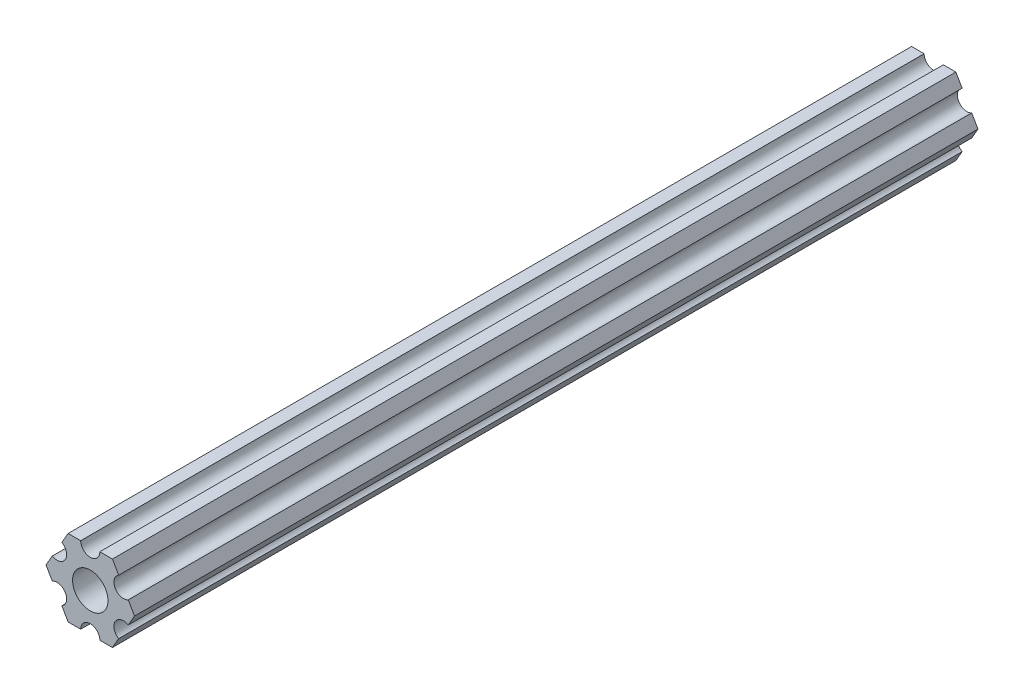
ISO-10303-21;
HEADER;
FILE_DESCRIPTION(('STEP AP214'),'2;1');
FILE_NAME('part.step','',(''),(''),'','','');
FILE_SCHEMA(('AUTOMOTIVE_DESIGN { 1 0 10303 214 1 1 1 1 }'));
ENDSEC;
DATA;
#1=APPLICATION_CONTEXT('core data for automotive mechanical design processes');
#2=APPLICATION_PROTOCOL_DEFINITION('international standard','automotive_design',2000,#1);
#3=PRODUCT_CONTEXT('',#1,'mechanical');
#4=PRODUCT('Part','Part','',(#3));
#5=PRODUCT_RELATED_PRODUCT_CATEGORY('part','',(#4));
#6=PRODUCT_DEFINITION_FORMATION('','',#4);
#7=PRODUCT_DEFINITION_CONTEXT('part definition',#1,'design');
#8=PRODUCT_DEFINITION('design','',#6,#7);
#9=PRODUCT_DEFINITION_SHAPE('','',#8);
#10=(LENGTH_UNIT() NAMED_UNIT(*) SI_UNIT(.MILLI.,.METRE.));
#11=(NAMED_UNIT(*) PLANE_ANGLE_UNIT() SI_UNIT($,.RADIAN.));
#12=(NAMED_UNIT(*) SI_UNIT($,.STERADIAN.) SOLID_ANGLE_UNIT());
#13=UNCERTAINTY_MEASURE_WITH_UNIT(LENGTH_MEASURE(1.E-05),#10,'distance_accuracy_value','');
#14=(GEOMETRIC_REPRESENTATION_CONTEXT(3) GLOBAL_UNCERTAINTY_ASSIGNED_CONTEXT((#13)) GLOBAL_UNIT_ASSIGNED_CONTEXT((#10,
#11,#12)) REPRESENTATION_CONTEXT('',''));
#15=CARTESIAN_POINT('',(0.,0.,0.));
#16=DIRECTION('',(0.,0.,1.));
#17=DIRECTION('',(1.,0.,0.));
#18=AXIS2_PLACEMENT_3D('',#15,#16,#17);
#19=CARTESIAN_POINT('',(6.29301142309098,-1.80018429024546,85.725));
#20=DIRECTION('',(-0.866025434075723,0.499999947533953,0.));
#21=DIRECTION('',(0.,0.,1.));
#22=AXIS2_PLACEMENT_3D('',#19,#20,#21);
#23=PLANE('',#22);
#24=DIRECTION('',(0.,0.,1.));
#25=VECTOR('',#24,1.);
#26=CARTESIAN_POINT('',(7.33234841870827,4.44212519169686E-07,85.725));
#27=LINE('',#26,#25);
#28=CARTESIAN_POINT('',(7.33234841870826,4.44212518961143E-07,-53.975));
#29=VERTEX_POINT('',#28);
#30=CARTESIAN_POINT('',(7.33234841870826,4.44212519315656E-07,85.725));
#31=VERTEX_POINT('',#30);
#32=EDGE_CURVE('E11',#29,#31,#27,.T.);
#33=ORIENTED_EDGE('',*,*,#32,.T.);
#34=DIRECTION('',(0.499999947533953,0.866025434075723,0.));
#35=VECTOR('',#34,1.);
#36=CARTESIAN_POINT('',(6.29301142309098,-1.80018429024546,85.725));
#37=LINE('',#36,#35);
#38=CARTESIAN_POINT('',(6.29301142309098,-1.80018429024546,85.725));
#39=VERTEX_POINT('',#38);
#40=EDGE_CURVE('E301',#39,#31,#37,.T.);
#41=ORIENTED_EDGE('',*,*,#40,.F.);
#42=DIRECTION('',(0.,0.,-1.));
#43=VECTOR('',#42,1.);
#44=CARTESIAN_POINT('',(6.29301142309098,-1.80018429024546,85.725));
#45=LINE('',#44,#43);
#46=CARTESIAN_POINT('',(6.29301142309098,-1.80018429024546,-53.975));
#47=VERTEX_POINT('',#46);
#48=EDGE_CURVE('E300',#39,#47,#45,.T.);
#49=ORIENTED_EDGE('',*,*,#48,.T.);
#50=DIRECTION('',(-0.499999947533953,-0.866025434075723,0.));
#51=VECTOR('',#50,1.);
#52=CARTESIAN_POINT('',(6.29301142309098,-1.80018429024546,-53.975));
#53=LINE('',#52,#51);
#54=EDGE_CURVE('E219',#29,#47,#53,.T.);
#55=ORIENTED_EDGE('',*,*,#54,.F.);
#56=EDGE_LOOP('',(#33,#41,#49,#55));
#57=FACE_BOUND('',#56,.T.);
#58=ADVANCED_FACE('F51',(#57),#23,.F.);
#59=CARTESIAN_POINT('',(7.33234841870827,4.44212519169686E-07,85.725));
#60=DIRECTION('',(-0.866025373493145,-0.500000052466057,0.));
#61=DIRECTION('',(-0.500000052466057,0.866025373493145,0.));
#62=AXIS2_PLACEMENT_3D('',#59,#60,#61);
#63=PLANE('',#62);
#64=DIRECTION('',(0.,0.,1.));
#65=VECTOR('',#64,1.);
#66=CARTESIAN_POINT('',(6.29301120497139,1.80018505273894,85.725));
#67=LINE('',#66,#65);
#68=CARTESIAN_POINT('',(6.29301120497139,1.80018505273894,-53.975));
#69=VERTEX_POINT('',#68);
#70=CARTESIAN_POINT('',(6.29301120497139,1.80018505273894,85.725));
#71=VERTEX_POINT('',#70);
#72=EDGE_CURVE('E59',#69,#71,#67,.T.);
#73=ORIENTED_EDGE('',*,*,#72,.T.);
#74=DIRECTION('',(-0.500000052466057,0.866025373493145,0.));
#75=VECTOR('',#74,1.);
#76=CARTESIAN_POINT('',(7.33234841870827,4.44212519198906E-07,85.725));
#77=LINE('',#76,#75);
#78=EDGE_CURVE('E305',#31,#71,#77,.T.);
#79=ORIENTED_EDGE('',*,*,#78,.F.);
#80=ORIENTED_EDGE('',*,*,#32,.F.);
#81=DIRECTION('',(0.500000052466055,-0.866025373493145,0.));
#82=VECTOR('',#81,1.);
#83=CARTESIAN_POINT('',(7.33234841870826,4.44212518961143E-07,-53.975));
#84=LINE('',#83,#82);
#85=EDGE_CURVE('E213',#69,#29,#84,.T.);
#86=ORIENTED_EDGE('',*,*,#85,.F.);
#87=EDGE_LOOP('',(#73,#79,#80,#86));
#88=FACE_BOUND('',#87,.T.);
#89=ADVANCED_FACE('F214',(#88),#63,.F.);
#90=CARTESIAN_POINT('',(4.70551103839172,4.54981561357972,85.725));
#91=DIRECTION('',(-0.866025373493151,-0.500000052466046,0.));
#92=DIRECTION('',(-0.500000052466046,0.866025373493151,0.));
#93=AXIS2_PLACEMENT_3D('',#90,#91,#92);
#94=PLANE('',#93);
#95=DIRECTION('',(0.,0.,1.));
#96=VECTOR('',#95,1.);
#97=CARTESIAN_POINT('',(3.66617382465481,6.35000022210627,85.725));
#98=LINE('',#97,#96);
#99=CARTESIAN_POINT('',(3.66617382465481,6.35000022210627,-53.975));
#100=VERTEX_POINT('',#99);
#101=CARTESIAN_POINT('',(3.66617382465481,6.35000022210627,85.725));
#102=VERTEX_POINT('',#101);
#103=EDGE_CURVE('E211',#100,#102,#98,.T.);
#104=ORIENTED_EDGE('',*,*,#103,.T.);
#105=DIRECTION('',(-0.500000052466046,0.866025373493151,0.));
#106=VECTOR('',#105,1.);
#107=CARTESIAN_POINT('',(4.70551103839172,4.54981561357972,85.725));
#108=LINE('',#107,#106);
#109=CARTESIAN_POINT('',(4.70551103839172,4.54981561357972,85.725));
#110=VERTEX_POINT('',#109);
#111=EDGE_CURVE('E336',#110,#102,#108,.T.);
#112=ORIENTED_EDGE('',*,*,#111,.F.);
#113=DIRECTION('',(0.,0.,1.));
#114=VECTOR('',#113,1.);
#115=CARTESIAN_POINT('',(4.70551103839172,4.54981561357972,85.725));
#116=LINE('',#115,#114);
#117=CARTESIAN_POINT('',(4.70551103839172,4.54981561357972,-53.975));
#118=VERTEX_POINT('',#117);
#119=EDGE_CURVE('E299',#118,#110,#116,.T.);
#120=ORIENTED_EDGE('',*,*,#119,.F.);
#121=DIRECTION('',(0.500000052466045,-0.866025373493151,0.));
#122=VECTOR('',#121,1.);
#123=CARTESIAN_POINT('',(4.70551103839172,4.54981561357972,-53.975));
#124=LINE('',#123,#122);
#125=EDGE_CURVE('E225',#100,#118,#124,.T.);
#126=ORIENTED_EDGE('',*,*,#125,.F.);
#127=EDGE_LOOP('',(#104,#112,#120,#126));
#128=FACE_BOUND('',#127,.T.);
#129=ADVANCED_FACE('F412',(#128),#94,.F.);
#130=CARTESIAN_POINT('',(3.66617382465481,6.35000022210627,85.725));
#131=DIRECTION('',(6.05825850611185E-08,-1.,0.));
#132=DIRECTION('',(0.,0.,-1.));
#133=AXIS2_PLACEMENT_3D('',#130,#131,#132);
#134=PLANE('',#133);
#135=DIRECTION('',(0.,0.,1.));
#136=VECTOR('',#135,1.);
#137=CARTESIAN_POINT('',(1.58749961530074,6.35000009617482,85.725));
#138=LINE('',#137,#136);
#139=CARTESIAN_POINT('',(1.58749961530073,6.35000015914054,-53.975));
#140=VERTEX_POINT('',#139);
#141=CARTESIAN_POINT('',(1.58749961530073,6.35000015914054,85.725));
#142=VERTEX_POINT('',#141);
#143=EDGE_CURVE('E333',#140,#142,#138,.T.);
#144=ORIENTED_EDGE('',*,*,#143,.T.);
#145=DIRECTION('',(-1.,0.,0.));
#146=VECTOR('',#145,1.);
#147=CARTESIAN_POINT('',(5.49926112168156,6.35000022210627,85.725));
#148=LINE('',#147,#146);
#149=EDGE_CURVE('E340',#102,#142,#148,.T.);
#150=ORIENTED_EDGE('',*,*,#149,.F.);
#151=ORIENTED_EDGE('',*,*,#103,.F.);
#152=DIRECTION('',(1.,3.02912931564594E-08,0.));
#153=VECTOR('',#152,1.);
#154=CARTESIAN_POINT('',(3.66617382465481,6.35000022210627,-53.975));
#155=LINE('',#154,#153);
#156=EDGE_CURVE('E287',#140,#100,#155,.T.);
#157=ORIENTED_EDGE('',*,*,#156,.F.);
#158=EDGE_LOOP('',(#144,#150,#151,#157));
#159=FACE_BOUND('',#158,.T.);
#160=ADVANCED_FACE('F415',(#159),#134,.F.);
#161=CARTESIAN_POINT('',(-3.84699260060323E-07,6.35,85.725));
#162=DIRECTION('',(0.,0.,-1.));
#163=DIRECTION('',(-1.,0.,0.));
#164=AXIS2_PLACEMENT_3D('',#161,#162,#163);
#165=CYLINDRICAL_SURFACE('',#164,1.5875);
#166=DIRECTION('',(0.,0.,1.));
#167=VECTOR('',#166,1.);
#168=CARTESIAN_POINT('',(-1.58750038469926,6.34999990382518,85.725));
#169=LINE('',#168,#167);
#170=CARTESIAN_POINT('',(-1.58750038469926,6.34999990382519,-53.975));
#171=VERTEX_POINT('',#170);
#172=CARTESIAN_POINT('',(-1.58750038469926,6.34999990382519,85.725));
#173=VERTEX_POINT('',#172);
#174=EDGE_CURVE('E330',#171,#173,#169,.T.);
#175=ORIENTED_EDGE('',*,*,#174,.T.);
#176=CARTESIAN_POINT('',(-3.84699260060323E-07,6.35,85.725));
#177=DIRECTION('',(0.,0.,-1.));
#178=DIRECTION('',(-1.,0.,0.));
#179=AXIS2_PLACEMENT_3D('',#176,#177,#178);
#180=CIRCLE('',#179,1.5875);
#181=EDGE_CURVE('E344',#142,#173,#180,.T.);
#182=ORIENTED_EDGE('',*,*,#181,.F.);
#183=ORIENTED_EDGE('',*,*,#143,.F.);
#184=CARTESIAN_POINT('',(-3.84699260060323E-07,6.35,-53.975));
#185=DIRECTION('',(0.,0.,1.));
#186=DIRECTION('',(-1.,0.,0.));
#187=AXIS2_PLACEMENT_3D('',#184,#185,#186);
#188=CIRCLE('',#187,1.5875);
#189=EDGE_CURVE('E283',#171,#140,#188,.T.);
#190=ORIENTED_EDGE('',*,*,#189,.F.);
#191=EDGE_LOOP('',(#175,#182,#183,#190));
#192=FACE_BOUND('',#191,.T.);
#193=ADVANCED_FACE('F464',(#192),#165,.F.);
#194=CARTESIAN_POINT('',(-1.58750038469926,6.34999990382518,85.725));
#195=DIRECTION('',(6.05825963273174E-08,-1.,0.));
#196=DIRECTION('',(0.,0.,-1.));
#197=AXIS2_PLACEMENT_3D('',#194,#195,#196);
#198=PLANE('',#197);
#199=DIRECTION('',(0.,0.,1.));
#200=VECTOR('',#199,1.);
#201=CARTESIAN_POINT('',(-3.66617459405349,6.3499997778937,85.725));
#202=LINE('',#201,#200);
#203=CARTESIAN_POINT('',(-3.66617454558244,6.34999986184803,-53.975));
#204=VERTEX_POINT('',#203);
#205=CARTESIAN_POINT('',(-3.66617454558244,6.34999986184803,85.725));
#206=VERTEX_POINT('',#205);
#207=EDGE_CURVE('E323',#204,#206,#202,.T.);
#208=ORIENTED_EDGE('',*,*,#207,.T.);
#209=DIRECTION('',(-1.,0.,0.));
#210=VECTOR('',#209,1.);
#211=CARTESIAN_POINT('',(5.49926112168156,6.34999990382519,85.725));
#212=LINE('',#211,#210);
#213=EDGE_CURVE('E348',#173,#206,#212,.T.);
#214=ORIENTED_EDGE('',*,*,#213,.F.);
#215=ORIENTED_EDGE('',*,*,#174,.F.);
#216=DIRECTION('',(1.,2.0194198968488E-08,0.));
#217=VECTOR('',#216,1.);
#218=CARTESIAN_POINT('',(-1.58750038469926,6.34999990382519,-53.975));
#219=LINE('',#218,#217);
#220=EDGE_CURVE('E279',#204,#171,#219,.T.);
#221=ORIENTED_EDGE('',*,*,#220,.F.);
#222=EDGE_LOOP('',(#208,#214,#215,#221));
#223=FACE_BOUND('',#222,.T.);
#224=ADVANCED_FACE('F461',(#223),#198,.F.);
#225=CARTESIAN_POINT('',(-3.66617459405349,6.3499997778937,85.725));
#226=DIRECTION('',(0.866025434075729,-0.499999947533942,0.));
#227=DIRECTION('',(0.,0.,-1.));
#228=AXIS2_PLACEMENT_3D('',#225,#226,#227);
#229=PLANE('',#228);
#230=DIRECTION('',(0.,0.,1.));
#231=VECTOR('',#230,1.);
#232=CARTESIAN_POINT('',(-4.70551158967065,4.54981504343587,85.725));
#233=LINE('',#232,#231);
#234=CARTESIAN_POINT('',(-4.70551158967065,4.54981504343587,-53.975));
#235=VERTEX_POINT('',#234);
#236=CARTESIAN_POINT('',(-4.70551158967065,4.54981504343587,85.725));
#237=VERTEX_POINT('',#236);
#238=EDGE_CURVE('E320',#235,#237,#233,.T.);
#239=ORIENTED_EDGE('',*,*,#238,.T.);
#240=DIRECTION('',(-0.499999947533943,-0.866025434075729,0.));
#241=VECTOR('',#240,1.);
#242=CARTESIAN_POINT('',(-3.66617459405349,6.3499997778937,85.725));
#243=LINE('',#242,#241);
#244=EDGE_CURVE('E352',#206,#237,#243,.T.);
#245=ORIENTED_EDGE('',*,*,#244,.F.);
#246=ORIENTED_EDGE('',*,*,#207,.F.);
#247=DIRECTION('',(0.499999947533939,0.866025434075731,0.));
#248=VECTOR('',#247,1.);
#249=CARTESIAN_POINT('',(-3.66617454558244,6.34999986184803,-53.975));
#250=LINE('',#249,#248);
#251=EDGE_CURVE('E275',#235,#204,#250,.T.);
#252=ORIENTED_EDGE('',*,*,#251,.F.);
#253=EDGE_LOOP('',(#239,#245,#246,#252));
#254=FACE_BOUND('',#253,.T.);
#255=ADVANCED_FACE('F457',(#254),#229,.F.);
#256=CARTESIAN_POINT('',(-5.49926150638082,3.17499966684067,85.725));
#257=DIRECTION('',(0.,0.,-1.));
#258=DIRECTION('',(-1.,0.,0.));
#259=AXIS2_PLACEMENT_3D('',#256,#257,#258);
#260=CYLINDRICAL_SURFACE('',#259,1.5875);
#261=DIRECTION('',(0.,0.,1.));
#262=VECTOR('',#261,1.);
#263=CARTESIAN_POINT('',(-6.29301142309098,1.80018429024547,85.725));
#264=LINE('',#263,#262);
#265=CARTESIAN_POINT('',(-6.29301142309098,1.80018429024546,-53.975));
#266=VERTEX_POINT('',#265);
#267=CARTESIAN_POINT('',(-6.29301142309098,1.80018429024547,85.725));
#268=VERTEX_POINT('',#267);
#269=EDGE_CURVE('E324',#266,#268,#264,.T.);
#270=ORIENTED_EDGE('',*,*,#269,.T.);
#271=CARTESIAN_POINT('',(-5.49926150638082,3.17499966684067,85.725));
#272=DIRECTION('',(0.,0.,-1.));
#273=DIRECTION('',(-1.,0.,0.));
#274=AXIS2_PLACEMENT_3D('',#271,#272,#273);
#275=CIRCLE('',#274,1.5875);
#276=EDGE_CURVE('E362',#237,#268,#275,.T.);
#277=ORIENTED_EDGE('',*,*,#276,.F.);
#278=ORIENTED_EDGE('',*,*,#238,.F.);
#279=CARTESIAN_POINT('',(-5.49926150638082,3.17499966684067,-53.975));
#280=DIRECTION('',(0.,0.,1.));
#281=DIRECTION('',(-1.,0.,0.));
#282=AXIS2_PLACEMENT_3D('',#279,#280,#281);
#283=CIRCLE('',#282,1.5875);
#284=EDGE_CURVE('E271',#266,#235,#283,.T.);
#285=ORIENTED_EDGE('',*,*,#284,.F.);
#286=EDGE_LOOP('',(#270,#277,#278,#285));
#287=FACE_BOUND('',#286,.T.);
#288=ADVANCED_FACE('F453',(#287),#260,.F.);
#289=CARTESIAN_POINT('',(-6.29301142309098,1.80018429024547,85.725));
#290=DIRECTION('',(0.866025434075724,-0.499999947533952,0.));
#291=DIRECTION('',(0.,0.,-1.));
#292=AXIS2_PLACEMENT_3D('',#289,#290,#291);
#293=PLANE('',#292);
#294=DIRECTION('',(0.,0.,1.));
#295=VECTOR('',#294,1.);
#296=CARTESIAN_POINT('',(-7.33234841870827,-4.44212523790841E-07,85.725));
#297=LINE('',#296,#295);
#298=CARTESIAN_POINT('',(-7.33234841870826,-4.44212524036367E-07,-53.975));
#299=VERTEX_POINT('',#298);
#300=CARTESIAN_POINT('',(-7.33234841870826,-4.44212524036367E-07,85.725));
#301=VERTEX_POINT('',#300);
#302=EDGE_CURVE('E317',#299,#301,#297,.T.);
#303=ORIENTED_EDGE('',*,*,#302,.T.);
#304=DIRECTION('',(-0.499999947533952,-0.866025434075724,0.));
#305=VECTOR('',#304,1.);
#306=CARTESIAN_POINT('',(-6.29301142309098,1.80018429024547,85.725));
#307=LINE('',#306,#305);
#308=EDGE_CURVE('E358',#268,#301,#307,.T.);
#309=ORIENTED_EDGE('',*,*,#308,.F.);
#310=ORIENTED_EDGE('',*,*,#269,.F.);
#311=DIRECTION('',(0.499999947533951,0.866025434075724,0.));
#312=VECTOR('',#311,1.);
#313=CARTESIAN_POINT('',(-6.29301142309098,1.80018429024547,-53.975));
#314=LINE('',#313,#312);
#315=EDGE_CURVE('E267',#299,#266,#314,.T.);
#316=ORIENTED_EDGE('',*,*,#315,.F.);
#317=EDGE_LOOP('',(#303,#309,#310,#316));
#318=FACE_BOUND('',#317,.T.);
#319=ADVANCED_FACE('F449',(#318),#293,.F.);
#320=CARTESIAN_POINT('',(-7.33234841870827,-4.44212523790841E-07,85.725));
#321=DIRECTION('',(0.866025373493151,0.500000052466045,0.));
#322=DIRECTION('',(0.,0.,-1.));
#323=AXIS2_PLACEMENT_3D('',#320,#321,#322);
#324=PLANE('',#323);
#325=DIRECTION('',(0.,0.,1.));
#326=VECTOR('',#325,1.);
#327=CARTESIAN_POINT('',(-6.29301120497141,-1.80018505273897,85.725));
#328=LINE('',#327,#326);
#329=CARTESIAN_POINT('',(-6.29301120497141,-1.80018505273897,-53.975));
#330=VERTEX_POINT('',#329);
#331=CARTESIAN_POINT('',(-6.29301120497141,-1.80018505273897,85.725));
#332=VERTEX_POINT('',#331);
#333=EDGE_CURVE('E310',#330,#332,#328,.T.);
#334=ORIENTED_EDGE('',*,*,#333,.T.);
#335=DIRECTION('',(0.500000052466045,-0.866025373493151,0.));
#336=VECTOR('',#335,1.);
#337=CARTESIAN_POINT('',(-7.33234841870827,-4.44212523969395E-07,85.725));
#338=LINE('',#337,#336);
#339=EDGE_CURVE('E353',#301,#332,#338,.T.);
#340=ORIENTED_EDGE('',*,*,#339,.F.);
#341=ORIENTED_EDGE('',*,*,#302,.F.);
#342=DIRECTION('',(-0.500000052466045,0.866025373493152,0.));
#343=VECTOR('',#342,1.);
#344=CARTESIAN_POINT('',(-7.33234841870826,-4.44212524036367E-07,-53.975));
#345=LINE('',#344,#343);
#346=EDGE_CURVE('E263',#330,#299,#345,.T.);
#347=ORIENTED_EDGE('',*,*,#346,.F.);
#348=EDGE_LOOP('',(#334,#340,#341,#347));
#349=FACE_BOUND('',#348,.T.);
#350=ADVANCED_FACE('F445',(#349),#324,.F.);
#351=CARTESIAN_POINT('',(-5.49926112168156,-3.17500033315934,85.725));
#352=DIRECTION('',(0.,0.,-1.));
#353=DIRECTION('',(-1.,0.,0.));
#354=AXIS2_PLACEMENT_3D('',#351,#352,#353);
#355=CYLINDRICAL_SURFACE('',#354,1.5875);
#356=DIRECTION('',(0.,0.,1.));
#357=VECTOR('',#356,1.);
#358=CARTESIAN_POINT('',(-4.70551103839172,-4.54981561357972,85.725));
#359=LINE('',#358,#357);
#360=CARTESIAN_POINT('',(-4.70551103839172,-4.54981561357972,-53.975));
#361=VERTEX_POINT('',#360);
#362=CARTESIAN_POINT('',(-4.70551103839172,-4.54981561357972,85.725));
#363=VERTEX_POINT('',#362);
#364=EDGE_CURVE('E307',#361,#363,#359,.T.);
#365=ORIENTED_EDGE('',*,*,#364,.T.);
#366=CARTESIAN_POINT('',(-5.49926112168156,-3.17500033315934,85.725));
#367=DIRECTION('',(0.,0.,-1.));
#368=DIRECTION('',(-1.,0.,0.));
#369=AXIS2_PLACEMENT_3D('',#366,#367,#368);
#370=CIRCLE('',#369,1.5875);
#371=EDGE_CURVE('E357',#332,#363,#370,.T.);
#372=ORIENTED_EDGE('',*,*,#371,.F.);
#373=ORIENTED_EDGE('',*,*,#333,.F.);
#374=CARTESIAN_POINT('',(-5.49926112168156,-3.17500033315934,-53.975));
#375=DIRECTION('',(0.,0.,1.));
#376=DIRECTION('',(-1.,0.,0.));
#377=AXIS2_PLACEMENT_3D('',#374,#375,#376);
#378=CIRCLE('',#377,1.5875);
#379=EDGE_CURVE('E259',#361,#330,#378,.T.);
#380=ORIENTED_EDGE('',*,*,#379,.F.);
#381=EDGE_LOOP('',(#365,#372,#373,#380));
#382=FACE_BOUND('',#381,.T.);
#383=ADVANCED_FACE('F441',(#382),#355,.F.);
#384=CARTESIAN_POINT('',(-4.70551103839172,-4.54981561357972,85.725));
#385=DIRECTION('',(0.866025373493152,0.500000052466045,0.));
#386=DIRECTION('',(0.,0.,-1.));
#387=AXIS2_PLACEMENT_3D('',#384,#385,#386);
#388=PLANE('',#387);
#389=DIRECTION('',(0.,0.,1.));
#390=VECTOR('',#389,1.);
#391=CARTESIAN_POINT('',(-3.66617382465481,-6.35000022210628,85.725));
#392=LINE('',#391,#390);
#393=CARTESIAN_POINT('',(-3.66617382465481,-6.35000022210628,-53.975));
#394=VERTEX_POINT('',#393);
#395=CARTESIAN_POINT('',(-3.66617382465481,-6.35000022210628,85.725));
#396=VERTEX_POINT('',#395);
#397=EDGE_CURVE('E311',#394,#396,#392,.T.);
#398=ORIENTED_EDGE('',*,*,#397,.T.);
#399=DIRECTION('',(0.500000052466045,-0.866025373493151,0.));
#400=VECTOR('',#399,1.);
#401=CARTESIAN_POINT('',(-4.70551103839172,-4.54981561357972,85.725));
#402=LINE('',#401,#400);
#403=EDGE_CURVE('E372',#363,#396,#402,.T.);
#404=ORIENTED_EDGE('',*,*,#403,.F.);
#405=ORIENTED_EDGE('',*,*,#364,.F.);
#406=DIRECTION('',(-0.500000052466043,0.866025373493152,0.));
#407=VECTOR('',#406,1.);
#408=CARTESIAN_POINT('',(-4.70551103839172,-4.54981561357972,-53.975));
#409=LINE('',#408,#407);
#410=EDGE_CURVE('E255',#394,#361,#409,.T.);
#411=ORIENTED_EDGE('',*,*,#410,.F.);
#412=EDGE_LOOP('',(#398,#404,#405,#411));
#413=FACE_BOUND('',#412,.T.);
#414=ADVANCED_FACE('F437',(#413),#388,.F.);
#415=CARTESIAN_POINT('',(-3.66617382465481,-6.35000022210628,85.725));
#416=DIRECTION('',(-6.05825854783851E-08,1.,0.));
#417=DIRECTION('',(0.,0.,1.));
#418=AXIS2_PLACEMENT_3D('',#415,#416,#417);
#419=PLANE('',#418);
#420=DIRECTION('',(0.,0.,1.));
#421=VECTOR('',#420,1.);
#422=CARTESIAN_POINT('',(-1.58749961530074,-6.35,85.725));
#423=LINE('',#422,#421);
#424=CARTESIAN_POINT('',(-1.58749961530073,-6.35000011105314,-53.975));
#425=VERTEX_POINT('',#424);
#426=CARTESIAN_POINT('',(-1.58749961530073,-6.35000011105314,85.725));
#427=VERTEX_POINT('',#426);
#428=EDGE_CURVE('E82',#425,#427,#423,.T.);
#429=ORIENTED_EDGE('',*,*,#428,.T.);
#430=DIRECTION('',(1.,0.,0.));
#431=VECTOR('',#430,1.);
#432=CARTESIAN_POINT('',(5.49926112168156,-6.35000022210628,85.725));
#433=LINE('',#432,#431);
#434=EDGE_CURVE('E376',#396,#427,#433,.T.);
#435=ORIENTED_EDGE('',*,*,#434,.F.);
#436=ORIENTED_EDGE('',*,*,#397,.F.);
#437=DIRECTION('',(-0.999999999999999,-5.34249856349036E-08,0.));
#438=VECTOR('',#437,1.);
#439=CARTESIAN_POINT('',(-3.66617382465481,-6.35000022210628,-53.975));
#440=LINE('',#439,#438);
#441=EDGE_CURVE('E251',#425,#394,#440,.T.);
#442=ORIENTED_EDGE('',*,*,#441,.F.);
#443=EDGE_LOOP('',(#429,#435,#436,#442));
#444=FACE_BOUND('',#443,.T.);
#445=ADVANCED_FACE('F434',(#444),#419,.F.);
#446=CARTESIAN_POINT('',(3.8469926204343E-07,-6.35,85.725));
#447=DIRECTION('',(0.,0.,-1.));
#448=DIRECTION('',(-1.,0.,0.));
#449=AXIS2_PLACEMENT_3D('',#446,#447,#448);
#450=CYLINDRICAL_SURFACE('',#449,1.5875);
#451=DIRECTION('',(0.,0.,1.));
#452=VECTOR('',#451,1.);
#453=CARTESIAN_POINT('',(1.58750038469926,-6.34999990382518,85.725));
#454=LINE('',#453,#452);
#455=CARTESIAN_POINT('',(1.58750038469926,-6.34999990382519,-53.975));
#456=VERTEX_POINT('',#455);
#457=CARTESIAN_POINT('',(1.58750038469926,-6.34999990382519,85.725));
#458=VERTEX_POINT('',#457);
#459=EDGE_CURVE('E71',#456,#458,#454,.T.);
#460=ORIENTED_EDGE('',*,*,#459,.T.);
#461=CARTESIAN_POINT('',(3.8469926204343E-07,-6.35,85.725));
#462=DIRECTION('',(0.,0.,-1.));
#463=DIRECTION('',(-1.,0.,0.));
#464=AXIS2_PLACEMENT_3D('',#461,#462,#463);
#465=CIRCLE('',#464,1.5875);
#466=EDGE_CURVE('E380',#427,#458,#465,.T.);
#467=ORIENTED_EDGE('',*,*,#466,.F.);
#468=ORIENTED_EDGE('',*,*,#428,.F.);
#469=CARTESIAN_POINT('',(3.8469926204343E-07,-6.35,-53.975));
#470=DIRECTION('',(0.,0.,1.));
#471=DIRECTION('',(-1.,0.,0.));
#472=AXIS2_PLACEMENT_3D('',#469,#470,#471);
#473=CIRCLE('',#472,1.5875);
#474=EDGE_CURVE('E247',#456,#425,#473,.T.);
#475=ORIENTED_EDGE('',*,*,#474,.F.);
#476=EDGE_LOOP('',(#460,#467,#468,#475));
#477=FACE_BOUND('',#476,.T.);
#478=ADVANCED_FACE('F432',(#477),#450,.F.);
#479=CARTESIAN_POINT('',(1.58750038469926,-6.34999990382518,85.725));
#480=DIRECTION('',(-6.05825721258438E-08,1.,0.));
#481=DIRECTION('',(0.,0.,1.));
#482=AXIS2_PLACEMENT_3D('',#479,#480,#481);
#483=PLANE('',#482);
#484=DIRECTION('',(0.,0.,1.));
#485=VECTOR('',#484,1.);
#486=CARTESIAN_POINT('',(3.66617459405346,-6.34999977789375,85.725));
#487=LINE('',#486,#485);
#488=CARTESIAN_POINT('',(3.66617454558244,-6.34999986184804,-53.975));
#489=VERTEX_POINT('',#488);
#490=CARTESIAN_POINT('',(3.66617454558244,-6.34999986184804,85.725));
#491=VERTEX_POINT('',#490);
#492=EDGE_CURVE('E381',#489,#491,#487,.T.);
#493=ORIENTED_EDGE('',*,*,#492,.T.);
#494=DIRECTION('',(1.,0.,0.));
#495=VECTOR('',#494,1.);
#496=CARTESIAN_POINT('',(5.49926112168156,-6.34999990382519,85.725));
#497=LINE('',#496,#495);
#498=EDGE_CURVE('E388',#458,#491,#497,.T.);
#499=ORIENTED_EDGE('',*,*,#498,.F.);
#500=ORIENTED_EDGE('',*,*,#459,.F.);
#501=DIRECTION('',(-1.,-2.01941943785532E-08,0.));
#502=VECTOR('',#501,1.);
#503=CARTESIAN_POINT('',(1.58750038469926,-6.34999990382519,-53.975));
#504=LINE('',#503,#502);
#505=EDGE_CURVE('E243',#489,#456,#504,.T.);
#506=ORIENTED_EDGE('',*,*,#505,.F.);
#507=EDGE_LOOP('',(#493,#499,#500,#506));
#508=FACE_BOUND('',#507,.T.);
#509=ADVANCED_FACE('F431',(#508),#483,.F.);
#510=CARTESIAN_POINT('',(3.66617459405346,-6.34999977789375,85.725));
#511=DIRECTION('',(-0.86602543407573,0.499999947533941,0.));
#512=DIRECTION('',(0.,0.,1.));
#513=AXIS2_PLACEMENT_3D('',#510,#511,#512);
#514=PLANE('',#513);
#515=DIRECTION('',(0.,0.,-1.));
#516=VECTOR('',#515,1.);
#517=CARTESIAN_POINT('',(4.70551158967065,-4.54981504343587,85.725));
#518=LINE('',#517,#516);
#519=CARTESIAN_POINT('',(4.70551158967065,-4.54981504343587,85.725));
#520=VERTEX_POINT('',#519);
#521=CARTESIAN_POINT('',(4.70551158967065,-4.54981504343587,-53.975));
#522=VERTEX_POINT('',#521);
#523=EDGE_CURVE('E384',#520,#522,#518,.T.);
#524=ORIENTED_EDGE('',*,*,#523,.F.);
#525=DIRECTION('',(0.49999994753394,0.86602543407573,0.));
#526=VECTOR('',#525,1.);
#527=CARTESIAN_POINT('',(3.66617459405346,-6.34999977789376,85.725));
#528=LINE('',#527,#526);
#529=EDGE_CURVE('E306',#491,#520,#528,.T.);
#530=ORIENTED_EDGE('',*,*,#529,.F.);
#531=ORIENTED_EDGE('',*,*,#492,.F.);
#532=DIRECTION('',(-0.499999947533941,-0.86602543407573,0.));
#533=VECTOR('',#532,1.);
#534=CARTESIAN_POINT('',(3.66617454558244,-6.34999986184804,-53.975));
#535=LINE('',#534,#533);
#536=EDGE_CURVE('E239',#522,#489,#535,.T.);
#537=ORIENTED_EDGE('',*,*,#536,.F.);
#538=EDGE_LOOP('',(#524,#530,#531,#537));
#539=FACE_BOUND('',#538,.T.);
#540=ADVANCED_FACE('F428',(#539),#514,.F.);
#541=CARTESIAN_POINT('',(5.49926112168156,3.17500033315934,85.725));
#542=DIRECTION('',(0.,0.,1.));
#543=DIRECTION('',(1.,0.,0.));
#544=AXIS2_PLACEMENT_3D('',#541,#542,#543);
#545=PLANE('',#544);
#546=CARTESIAN_POINT('',(0.,0.,85.725));
#547=DIRECTION('',(0.,0.,-1.));
#548=DIRECTION('',(-1.,0.,0.));
#549=AXIS2_PLACEMENT_3D('',#546,#547,#548);
#550=CIRCLE('',#549,2.9337);
#551=CARTESIAN_POINT('',(-2.9337,0.,85.725));
#552=VERTEX_POINT('',#551);
#553=EDGE_CURVE('E292',#552,#552,#550,.T.);
#554=ORIENTED_EDGE('',*,*,#553,.T.);
#555=EDGE_LOOP('',(#554));
#556=FACE_BOUND('',#555,.T.);
#557=ORIENTED_EDGE('',*,*,#529,.T.);
#558=CARTESIAN_POINT('',(5.49926150638082,-3.17499966684067,85.725));
#559=DIRECTION('',(0.,0.,-1.));
#560=DIRECTION('',(-1.,0.,0.));
#561=AXIS2_PLACEMENT_3D('',#558,#559,#560);
#562=CIRCLE('',#561,1.5875);
#563=EDGE_CURVE('E296',#520,#39,#562,.T.);
#564=ORIENTED_EDGE('',*,*,#563,.T.);
#565=ORIENTED_EDGE('',*,*,#40,.T.);
#566=ORIENTED_EDGE('',*,*,#78,.T.);
#567=CARTESIAN_POINT('',(5.49926112168156,3.17500033315934,85.725));
#568=DIRECTION('',(0.,0.,-1.));
#569=DIRECTION('',(-1.,0.,0.));
#570=AXIS2_PLACEMENT_3D('',#567,#568,#569);
#571=CIRCLE('',#570,1.5875);
#572=EDGE_CURVE('E206',#71,#110,#571,.T.);
#573=ORIENTED_EDGE('',*,*,#572,.T.);
#574=ORIENTED_EDGE('',*,*,#111,.T.);
#575=ORIENTED_EDGE('',*,*,#149,.T.);
#576=ORIENTED_EDGE('',*,*,#181,.T.);
#577=ORIENTED_EDGE('',*,*,#213,.T.);
#578=ORIENTED_EDGE('',*,*,#244,.T.);
#579=ORIENTED_EDGE('',*,*,#276,.T.);
#580=ORIENTED_EDGE('',*,*,#308,.T.);
#581=ORIENTED_EDGE('',*,*,#339,.T.);
#582=ORIENTED_EDGE('',*,*,#371,.T.);
#583=ORIENTED_EDGE('',*,*,#403,.T.);
#584=ORIENTED_EDGE('',*,*,#434,.T.);
#585=ORIENTED_EDGE('',*,*,#466,.T.);
#586=ORIENTED_EDGE('',*,*,#498,.T.);
#587=EDGE_LOOP('',(#557,#564,#565,#566,#573,#574,#575,#576,#577,#578,#579,#580,#581,#582,#583,
#584,#585,#586));
#588=FACE_BOUND('',#587,.T.);
#589=ADVANCED_FACE('F418',(#556,#588),#545,.T.);
#590=CARTESIAN_POINT('',(5.49926112168156,3.17500033315934,85.725));
#591=DIRECTION('',(0.,0.,-1.));
#592=DIRECTION('',(-1.,0.,0.));
#593=AXIS2_PLACEMENT_3D('',#590,#591,#592);
#594=CYLINDRICAL_SURFACE('',#593,1.5875);
#595=ORIENTED_EDGE('',*,*,#572,.F.);
#596=ORIENTED_EDGE('',*,*,#72,.F.);
#597=CARTESIAN_POINT('',(5.49926112168156,3.17500033315934,-53.975));
#598=DIRECTION('',(0.,0.,1.));
#599=DIRECTION('',(-1.,0.,0.));
#600=AXIS2_PLACEMENT_3D('',#597,#598,#599);
#601=CIRCLE('',#600,1.5875);
#602=EDGE_CURVE('E203',#118,#69,#601,.T.);
#603=ORIENTED_EDGE('',*,*,#602,.F.);
#604=ORIENTED_EDGE('',*,*,#119,.T.);
#605=EDGE_LOOP('',(#595,#596,#603,#604));
#606=FACE_BOUND('',#605,.T.);
#607=ADVANCED_FACE('F200',(#606),#594,.F.);
#608=CARTESIAN_POINT('',(5.49926150638082,-3.17499966684067,85.725));
#609=DIRECTION('',(0.,0.,-1.));
#610=DIRECTION('',(-1.,0.,0.));
#611=AXIS2_PLACEMENT_3D('',#608,#609,#610);
#612=CYLINDRICAL_SURFACE('',#611,1.5875);
#613=ORIENTED_EDGE('',*,*,#563,.F.);
#614=ORIENTED_EDGE('',*,*,#523,.T.);
#615=CARTESIAN_POINT('',(5.49926150638082,-3.17499966684067,-53.975));
#616=DIRECTION('',(0.,0.,1.));
#617=DIRECTION('',(-1.,0.,0.));
#618=AXIS2_PLACEMENT_3D('',#615,#616,#617);
#619=CIRCLE('',#618,1.5875);
#620=EDGE_CURVE('E235',#47,#522,#619,.T.);
#621=ORIENTED_EDGE('',*,*,#620,.F.);
#622=ORIENTED_EDGE('',*,*,#48,.F.);
#623=EDGE_LOOP('',(#613,#614,#621,#622));
#624=FACE_BOUND('',#623,.T.);
#625=ADVANCED_FACE('F423',(#624),#612,.F.);
#626=CARTESIAN_POINT('',(0.,0.,85.725));
#627=DIRECTION('',(0.,0.,-1.));
#628=DIRECTION('',(-1.,0.,0.));
#629=AXIS2_PLACEMENT_3D('',#626,#627,#628);
#630=CYLINDRICAL_SURFACE('',#629,2.9337);
#631=ORIENTED_EDGE('',*,*,#553,.F.);
#632=EDGE_LOOP('',(#631));
#633=FACE_BOUND('',#632,.T.);
#634=CARTESIAN_POINT('',(0.,0.,-53.975));
#635=DIRECTION('',(0.,0.,-1.));
#636=DIRECTION('',(-1.,0.,0.));
#637=AXIS2_PLACEMENT_3D('',#634,#635,#636);
#638=CIRCLE('',#637,2.9337);
#639=CARTESIAN_POINT('',(-2.9337,0.,-53.975));
#640=VERTEX_POINT('',#639);
#641=EDGE_CURVE('E227',#640,#640,#638,.T.);
#642=ORIENTED_EDGE('',*,*,#641,.T.);
#643=EDGE_LOOP('',(#642));
#644=FACE_BOUND('',#643,.T.);
#645=ADVANCED_FACE('F483',(#633,#644),#630,.F.);
#646=CARTESIAN_POINT('',(5.49926112168156,3.17500033315934,-53.975));
#647=DIRECTION('',(0.,0.,-1.));
#648=DIRECTION('',(-1.,0.,0.));
#649=AXIS2_PLACEMENT_3D('',#646,#647,#648);
#650=PLANE('',#649);
#651=ORIENTED_EDGE('',*,*,#602,.T.);
#652=ORIENTED_EDGE('',*,*,#85,.T.);
#653=ORIENTED_EDGE('',*,*,#54,.T.);
#654=ORIENTED_EDGE('',*,*,#620,.T.);
#655=ORIENTED_EDGE('',*,*,#536,.T.);
#656=ORIENTED_EDGE('',*,*,#505,.T.);
#657=ORIENTED_EDGE('',*,*,#474,.T.);
#658=ORIENTED_EDGE('',*,*,#441,.T.);
#659=ORIENTED_EDGE('',*,*,#410,.T.);
#660=ORIENTED_EDGE('',*,*,#379,.T.);
#661=ORIENTED_EDGE('',*,*,#346,.T.);
#662=ORIENTED_EDGE('',*,*,#315,.T.);
#663=ORIENTED_EDGE('',*,*,#284,.T.);
#664=ORIENTED_EDGE('',*,*,#251,.T.);
#665=ORIENTED_EDGE('',*,*,#220,.T.);
#666=ORIENTED_EDGE('',*,*,#189,.T.);
#667=ORIENTED_EDGE('',*,*,#156,.T.);
#668=ORIENTED_EDGE('',*,*,#125,.T.);
#669=EDGE_LOOP('',(#651,#652,#653,#654,#655,#656,#657,#658,#659,#660,#661,#662,#663,#664,#665,
#666,#667,#668));
#670=FACE_BOUND('',#669,.T.);
#671=ORIENTED_EDGE('',*,*,#641,.F.);
#672=EDGE_LOOP('',(#671));
#673=FACE_BOUND('',#672,.T.);
#674=ADVANCED_FACE('F221',(#670,#673),#650,.T.);
#675=CLOSED_SHELL('',(#58,#89,#129,#160,#193,#224,#255,#288,#319,#350,#383,#414,#445,#478,#509,
#540,#589,#607,#625,#645,#674));
#676=MANIFOLD_SOLID_BREP('B2',#675);
#677=ADVANCED_BREP_SHAPE_REPRESENTATION('',(#18,#676),#14);
#678=SHAPE_DEFINITION_REPRESENTATION(#9,#677);
ENDSEC;
END-ISO-10303-21;
